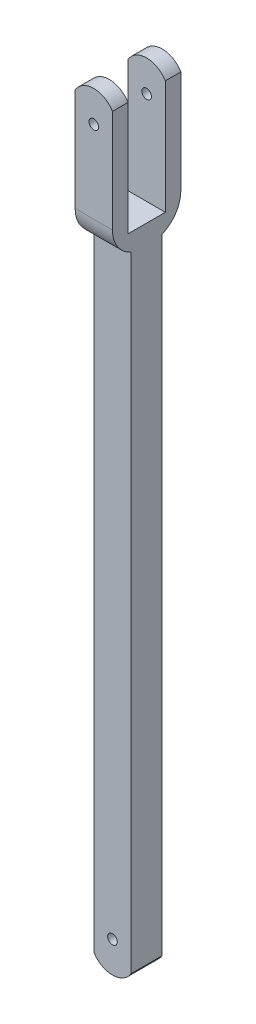
ISO-10303-21;
HEADER;
FILE_DESCRIPTION(('STEP AP214'),'2;1');
FILE_NAME('part.step','',(''),(''),'','','');
FILE_SCHEMA(('AUTOMOTIVE_DESIGN { 1 0 10303 214 1 1 1 1 }'));
ENDSEC;
DATA;
#1=APPLICATION_CONTEXT('core data for automotive mechanical design processes');
#2=APPLICATION_PROTOCOL_DEFINITION('international standard','automotive_design',2000,#1);
#3=PRODUCT_CONTEXT('',#1,'mechanical');
#4=PRODUCT('Part','Part','',(#3));
#5=PRODUCT_RELATED_PRODUCT_CATEGORY('part','',(#4));
#6=PRODUCT_DEFINITION_FORMATION('','',#4);
#7=PRODUCT_DEFINITION_CONTEXT('part definition',#1,'design');
#8=PRODUCT_DEFINITION('design','',#6,#7);
#9=PRODUCT_DEFINITION_SHAPE('','',#8);
#10=(LENGTH_UNIT() NAMED_UNIT(*) SI_UNIT(.MILLI.,.METRE.));
#11=(NAMED_UNIT(*) PLANE_ANGLE_UNIT() SI_UNIT($,.RADIAN.));
#12=(NAMED_UNIT(*) SI_UNIT($,.STERADIAN.) SOLID_ANGLE_UNIT());
#13=UNCERTAINTY_MEASURE_WITH_UNIT(LENGTH_MEASURE(1.E-05),#10,'distance_accuracy_value','');
#14=(GEOMETRIC_REPRESENTATION_CONTEXT(3) GLOBAL_UNCERTAINTY_ASSIGNED_CONTEXT((#13)) GLOBAL_UNIT_ASSIGNED_CONTEXT((#10,
#11,#12)) REPRESENTATION_CONTEXT('',''));
#15=CARTESIAN_POINT('',(0.,0.,0.));
#16=DIRECTION('',(0.,0.,1.));
#17=DIRECTION('',(1.,0.,0.));
#18=AXIS2_PLACEMENT_3D('',#15,#16,#17);
#19=CARTESIAN_POINT('',(-0.828531952075096,-148.107484930158,-11.));
#20=DIRECTION('',(0.,0.,1.));
#21=DIRECTION('',(1.,0.,0.));
#22=AXIS2_PLACEMENT_3D('',#19,#20,#21);
#23=CYLINDRICAL_SURFACE('',#22,7.);
#24=DIRECTION('',(0.,0.,1.));
#25=VECTOR('',#24,1.);
#26=CARTESIAN_POINT('',(-6.8285319520751,-151.713036205622,-11.));
#27=LINE('',#26,#25);
#28=CARTESIAN_POINT('',(-6.8285319520751,-151.713036205622,-5.));
#29=VERTEX_POINT('',#28);
#30=CARTESIAN_POINT('',(-6.8285319520751,-151.713036205622,5.));
#31=VERTEX_POINT('',#30);
#32=EDGE_CURVE('E137',#29,#31,#27,.T.);
#33=ORIENTED_EDGE('',*,*,#32,.F.);
#34=CARTESIAN_POINT('',(-0.828531952075096,-148.107484930158,-5.));
#35=DIRECTION('',(0.,0.,-1.));
#36=DIRECTION('',(-1.,0.,0.));
#37=AXIS2_PLACEMENT_3D('',#34,#35,#36);
#38=CIRCLE('',#37,7.);
#39=CARTESIAN_POINT('',(5.17146804792493,-151.713036205622,-5.));
#40=VERTEX_POINT('',#39);
#41=EDGE_CURVE('E121',#29,#40,#38,.F.);
#42=ORIENTED_EDGE('',*,*,#41,.T.);
#43=DIRECTION('',(0.,0.,1.));
#44=VECTOR('',#43,1.);
#45=CARTESIAN_POINT('',(5.1714680479249,-151.713036205622,-11.));
#46=LINE('',#45,#44);
#47=CARTESIAN_POINT('',(5.17146804792493,-151.713036205622,5.));
#48=VERTEX_POINT('',#47);
#49=EDGE_CURVE('E145',#40,#48,#46,.T.);
#50=ORIENTED_EDGE('',*,*,#49,.T.);
#51=CARTESIAN_POINT('',(-0.828531952075096,-148.107484930158,5.));
#52=DIRECTION('',(0.,0.,1.));
#53=DIRECTION('',(1.,0.,0.));
#54=AXIS2_PLACEMENT_3D('',#51,#52,#53);
#55=CIRCLE('',#54,7.);
#56=EDGE_CURVE('E144',#48,#31,#55,.F.);
#57=ORIENTED_EDGE('',*,*,#56,.T.);
#58=EDGE_LOOP('',(#33,#42,#50,#57));
#59=FACE_BOUND('',#58,.T.);
#60=ADVANCED_FACE('F33',(#59),#23,.T.);
#61=CARTESIAN_POINT('',(-0.828531952075101,-145.107484930158,-15.3840620433566));
#62=DIRECTION('',(0.,0.,1.));
#63=DIRECTION('',(1.,0.,0.));
#64=AXIS2_PLACEMENT_3D('',#61,#62,#63);
#65=CYLINDRICAL_SURFACE('',#64,1.54999999999999);
#66=CARTESIAN_POINT('',(-0.828531952075101,-145.107484930158,5.));
#67=DIRECTION('',(0.,0.,1.));
#68=DIRECTION('',(1.,0.,0.));
#69=AXIS2_PLACEMENT_3D('',#66,#67,#68);
#70=CIRCLE('',#69,1.54999999999999);
#71=CARTESIAN_POINT('',(0.721468047924893,-145.107484930158,5.));
#72=VERTEX_POINT('',#71);
#73=EDGE_CURVE('E170',#72,#72,#70,.F.);
#74=ORIENTED_EDGE('',*,*,#73,.F.);
#75=EDGE_LOOP('',(#74));
#76=FACE_BOUND('',#75,.T.);
#77=CARTESIAN_POINT('',(-0.828531952075101,-145.107484930158,-5.));
#78=DIRECTION('',(0.,0.,-1.));
#79=DIRECTION('',(-1.,0.,0.));
#80=AXIS2_PLACEMENT_3D('',#77,#78,#79);
#81=CIRCLE('',#80,1.54999999999999);
#82=CARTESIAN_POINT('',(-2.37853195207509,-145.107484930158,-5.));
#83=VERTEX_POINT('',#82);
#84=EDGE_CURVE('E133',#83,#83,#81,.F.);
#85=ORIENTED_EDGE('',*,*,#84,.F.);
#86=EDGE_LOOP('',(#85));
#87=FACE_BOUND('',#86,.T.);
#88=ADVANCED_FACE('F262',(#76,#87),#65,.F.);
#89=CARTESIAN_POINT('',(5.1714680479249,-151.713036205622,-11.));
#90=DIRECTION('',(1.,0.,0.));
#91=DIRECTION('',(0.,1.,0.));
#92=AXIS2_PLACEMENT_3D('',#89,#90,#91);
#93=PLANE('',#92);
#94=DIRECTION('',(0.,1.,0.));
#95=VECTOR('',#94,1.);
#96=CARTESIAN_POINT('',(5.1714680479249,49.2783305657349,-5.));
#97=LINE('',#96,#95);
#98=CARTESIAN_POINT('',(5.1714680479249,49.2783305657349,-5.));
#99=VERTEX_POINT('',#98);
#100=EDGE_CURVE('E128',#40,#99,#97,.T.);
#101=ORIENTED_EDGE('',*,*,#100,.T.);
#102=CARTESIAN_POINT('',(5.17146804792487,58.4434819556466,-0.999999999999999));
#103=DIRECTION('',(1.,0.,0.));
#104=DIRECTION('',(0.,1.,0.));
#105=AXIS2_PLACEMENT_3D('',#102,#103,#104);
#106=CIRCLE('',#105,10.);
#107=CARTESIAN_POINT('',(5.17146804792487,58.4434819556466,-11.));
#108=VERTEX_POINT('',#107);
#109=EDGE_CURVE('E41',#99,#108,#106,.T.);
#110=ORIENTED_EDGE('',*,*,#109,.T.);
#111=DIRECTION('',(0.,1.,0.));
#112=VECTOR('',#111,1.);
#113=CARTESIAN_POINT('',(5.1714680479249,-151.713036205622,-11.));
#114=LINE('',#113,#112);
#115=CARTESIAN_POINT('',(5.17146804792487,91.4980672775201,-11.));
#116=VERTEX_POINT('',#115);
#117=EDGE_CURVE('E184',#108,#116,#114,.T.);
#118=ORIENTED_EDGE('',*,*,#117,.T.);
#119=DIRECTION('',(0.,0.,1.));
#120=VECTOR('',#119,1.);
#121=CARTESIAN_POINT('',(5.17146804792487,91.4980672775201,-11.));
#122=LINE('',#121,#120);
#123=CARTESIAN_POINT('',(5.17146804792487,91.4980672775201,-6.));
#124=VERTEX_POINT('',#123);
#125=EDGE_CURVE('E158',#116,#124,#122,.T.);
#126=ORIENTED_EDGE('',*,*,#125,.T.);
#127=DIRECTION('',(0.,1.,0.));
#128=VECTOR('',#127,1.);
#129=CARTESIAN_POINT('',(5.1714680479249,-151.713036205622,-6.));
#130=LINE('',#129,#128);
#131=CARTESIAN_POINT('',(5.17146804792487,54.8925150698418,-6.));
#132=VERTEX_POINT('',#131);
#133=EDGE_CURVE('E225',#132,#124,#130,.T.);
#134=ORIENTED_EDGE('',*,*,#133,.F.);
#135=DIRECTION('',(0.,0.,-1.));
#136=VECTOR('',#135,1.);
#137=CARTESIAN_POINT('',(5.17146804792487,54.8925150698418,-11.));
#138=LINE('',#137,#136);
#139=CARTESIAN_POINT('',(5.17146804792487,54.8925150698418,6.));
#140=VERTEX_POINT('',#139);
#141=EDGE_CURVE('E221',#140,#132,#138,.T.);
#142=ORIENTED_EDGE('',*,*,#141,.F.);
#143=DIRECTION('',(0.,-1.,0.));
#144=VECTOR('',#143,1.);
#145=CARTESIAN_POINT('',(5.1714680479249,-151.713036205622,6.));
#146=LINE('',#145,#144);
#147=CARTESIAN_POINT('',(5.17146804792487,91.4980672775201,6.));
#148=VERTEX_POINT('',#147);
#149=EDGE_CURVE('E229',#148,#140,#146,.T.);
#150=ORIENTED_EDGE('',*,*,#149,.F.);
#151=CARTESIAN_POINT('',(5.17146804792487,91.4980672775201,11.));
#152=VERTEX_POINT('',#151);
#153=EDGE_CURVE('E148',#148,#152,#122,.T.);
#154=ORIENTED_EDGE('',*,*,#153,.T.);
#155=DIRECTION('',(0.,1.,0.));
#156=VECTOR('',#155,1.);
#157=CARTESIAN_POINT('',(5.1714680479249,-151.713036205622,11.));
#158=LINE('',#157,#156);
#159=CARTESIAN_POINT('',(5.17146804792487,58.4434819556466,11.));
#160=VERTEX_POINT('',#159);
#161=EDGE_CURVE('E236',#160,#152,#158,.T.);
#162=ORIENTED_EDGE('',*,*,#161,.F.);
#163=CARTESIAN_POINT('',(5.17146804792487,58.4434819556466,0.999999999999999));
#164=DIRECTION('',(1.,0.,0.));
#165=DIRECTION('',(0.,1.,0.));
#166=AXIS2_PLACEMENT_3D('',#163,#164,#165);
#167=CIRCLE('',#166,10.);
#168=CARTESIAN_POINT('',(5.1714680479249,49.2783305657349,5.));
#169=VERTEX_POINT('',#168);
#170=EDGE_CURVE('E178',#160,#169,#167,.T.);
#171=ORIENTED_EDGE('',*,*,#170,.T.);
#172=DIRECTION('',(0.,1.,0.));
#173=VECTOR('',#172,1.);
#174=CARTESIAN_POINT('',(5.1714680479249,49.2783305657349,5.));
#175=LINE('',#174,#173);
#176=EDGE_CURVE('E132',#48,#169,#175,.T.);
#177=ORIENTED_EDGE('',*,*,#176,.F.);
#178=ORIENTED_EDGE('',*,*,#49,.F.);
#179=EDGE_LOOP('',(#101,#110,#118,#126,#134,#142,#150,#154,#162,#171,#177,#178));
#180=FACE_BOUND('',#179,.T.);
#181=ADVANCED_FACE('F182',(#180),#93,.T.);
#182=CARTESIAN_POINT('',(-6.8285319520751,-151.713036205622,-11.));
#183=DIRECTION('',(-1.,0.,0.));
#184=DIRECTION('',(0.,-1.,0.));
#185=AXIS2_PLACEMENT_3D('',#182,#183,#184);
#186=PLANE('',#185);
#187=DIRECTION('',(0.,-1.,0.));
#188=VECTOR('',#187,1.);
#189=CARTESIAN_POINT('',(-6.8285319520751,-151.713036205622,-11.));
#190=LINE('',#189,#188);
#191=CARTESIAN_POINT('',(-6.82853195207513,91.4980654130911,-11.));
#192=VERTEX_POINT('',#191);
#193=CARTESIAN_POINT('',(-6.82853195207513,58.4434819556466,-11.));
#194=VERTEX_POINT('',#193);
#195=EDGE_CURVE('E194',#192,#194,#190,.T.);
#196=ORIENTED_EDGE('',*,*,#195,.T.);
#197=CARTESIAN_POINT('',(-6.82853195207513,58.4434819556466,-0.999999999999999));
#198=DIRECTION('',(-1.,0.,0.));
#199=DIRECTION('',(0.,-1.,0.));
#200=AXIS2_PLACEMENT_3D('',#197,#198,#199);
#201=CIRCLE('',#200,10.);
#202=CARTESIAN_POINT('',(-6.82853195207513,49.278330565735,-5.));
#203=VERTEX_POINT('',#202);
#204=EDGE_CURVE('E139',#194,#203,#201,.T.);
#205=ORIENTED_EDGE('',*,*,#204,.T.);
#206=DIRECTION('',(0.,-1.,0.));
#207=VECTOR('',#206,1.);
#208=CARTESIAN_POINT('',(-6.82853195207513,49.278330565735,-5.));
#209=LINE('',#208,#207);
#210=EDGE_CURVE('E125',#203,#29,#209,.T.);
#211=ORIENTED_EDGE('',*,*,#210,.T.);
#212=ORIENTED_EDGE('',*,*,#32,.T.);
#213=DIRECTION('',(0.,-1.,0.));
#214=VECTOR('',#213,1.);
#215=CARTESIAN_POINT('',(-6.82853195207513,49.278330565735,5.));
#216=LINE('',#215,#214);
#217=CARTESIAN_POINT('',(-6.82853195207513,49.278330565735,5.));
#218=VERTEX_POINT('',#217);
#219=EDGE_CURVE('E173',#218,#31,#216,.T.);
#220=ORIENTED_EDGE('',*,*,#219,.F.);
#221=CARTESIAN_POINT('',(-6.82853195207513,58.4434819556466,0.999999999999999));
#222=DIRECTION('',(-1.,0.,0.));
#223=DIRECTION('',(0.,-1.,0.));
#224=AXIS2_PLACEMENT_3D('',#221,#222,#223);
#225=CIRCLE('',#224,10.);
#226=CARTESIAN_POINT('',(-6.82853195207513,58.4434819556466,11.));
#227=VERTEX_POINT('',#226);
#228=EDGE_CURVE('E54',#218,#227,#225,.T.);
#229=ORIENTED_EDGE('',*,*,#228,.T.);
#230=DIRECTION('',(0.,-1.,0.));
#231=VECTOR('',#230,1.);
#232=CARTESIAN_POINT('',(-6.8285319520751,-151.713036205622,11.));
#233=LINE('',#232,#231);
#234=CARTESIAN_POINT('',(-6.82853195207513,91.4980654130911,11.));
#235=VERTEX_POINT('',#234);
#236=EDGE_CURVE('E234',#235,#227,#233,.T.);
#237=ORIENTED_EDGE('',*,*,#236,.F.);
#238=DIRECTION('',(0.,0.,1.));
#239=VECTOR('',#238,1.);
#240=CARTESIAN_POINT('',(-6.82853195207513,91.4980654130911,-11.));
#241=LINE('',#240,#239);
#242=CARTESIAN_POINT('',(-6.82853195207513,91.4980654130911,6.));
#243=VERTEX_POINT('',#242);
#244=EDGE_CURVE('E151',#243,#235,#241,.T.);
#245=ORIENTED_EDGE('',*,*,#244,.F.);
#246=DIRECTION('',(0.,1.,0.));
#247=VECTOR('',#246,1.);
#248=CARTESIAN_POINT('',(-6.8285319520751,-151.713036205622,6.));
#249=LINE('',#248,#247);
#250=CARTESIAN_POINT('',(-6.82853195207513,54.8925150698418,6.));
#251=VERTEX_POINT('',#250);
#252=EDGE_CURVE('E161',#251,#243,#249,.T.);
#253=ORIENTED_EDGE('',*,*,#252,.F.);
#254=DIRECTION('',(0.,0.,1.));
#255=VECTOR('',#254,1.);
#256=CARTESIAN_POINT('',(-6.82853195207513,54.8925150698418,-11.));
#257=LINE('',#256,#255);
#258=CARTESIAN_POINT('',(-6.82853195207513,54.8925150698418,-6.));
#259=VERTEX_POINT('',#258);
#260=EDGE_CURVE('E155',#259,#251,#257,.T.);
#261=ORIENTED_EDGE('',*,*,#260,.F.);
#262=DIRECTION('',(0.,-1.,0.));
#263=VECTOR('',#262,1.);
#264=CARTESIAN_POINT('',(-6.8285319520751,-151.713036205622,-6.));
#265=LINE('',#264,#263);
#266=CARTESIAN_POINT('',(-6.82853195207513,91.4980654130911,-6.));
#267=VERTEX_POINT('',#266);
#268=EDGE_CURVE('E157',#267,#259,#265,.T.);
#269=ORIENTED_EDGE('',*,*,#268,.F.);
#270=EDGE_CURVE('E146',#192,#267,#241,.T.);
#271=ORIENTED_EDGE('',*,*,#270,.F.);
#272=EDGE_LOOP('',(#196,#205,#211,#212,#220,#229,#237,#245,#253,#261,#269,#271));
#273=FACE_BOUND('',#272,.T.);
#274=ADVANCED_FACE('F136',(#273),#186,.T.);
#275=CARTESIAN_POINT('',(-0.828531391883958,87.8925150698418,-11.));
#276=DIRECTION('',(0.,0.,1.));
#277=DIRECTION('',(1.,0.,0.));
#278=AXIS2_PLACEMENT_3D('',#275,#276,#277);
#279=PLANE('',#278);
#280=CARTESIAN_POINT('',(-0.828531952075129,84.8904146624725,-11.));
#281=DIRECTION('',(0.,0.,1.));
#282=DIRECTION('',(1.,0.,0.));
#283=AXIS2_PLACEMENT_3D('',#280,#281,#282);
#284=CIRCLE('',#283,1.54999999999999);
#285=CARTESIAN_POINT('',(0.721468047924863,84.8904146624725,-11.));
#286=VERTEX_POINT('',#285);
#287=EDGE_CURVE('E169',#286,#286,#284,.F.);
#288=ORIENTED_EDGE('',*,*,#287,.F.);
#289=EDGE_LOOP('',(#288));
#290=FACE_BOUND('',#289,.T.);
#291=ORIENTED_EDGE('',*,*,#117,.F.);
#292=DIRECTION('',(1.,0.,0.));
#293=VECTOR('',#292,1.);
#294=CARTESIAN_POINT('',(-0.828531391883992,58.4434819556466,-11.));
#295=LINE('',#294,#293);
#296=EDGE_CURVE('E164',#108,#194,#295,.F.);
#297=ORIENTED_EDGE('',*,*,#296,.T.);
#298=ORIENTED_EDGE('',*,*,#195,.F.);
#299=CARTESIAN_POINT('',(-0.828531391883958,87.8925150698418,-11.));
#300=DIRECTION('',(0.,0.,1.));
#301=DIRECTION('',(1.,0.,0.));
#302=AXIS2_PLACEMENT_3D('',#299,#300,#301);
#303=CIRCLE('',#302,7.);
#304=EDGE_CURVE('E193',#116,#192,#303,.T.);
#305=ORIENTED_EDGE('',*,*,#304,.F.);
#306=EDGE_LOOP('',(#291,#297,#298,#305));
#307=FACE_BOUND('',#306,.T.);
#308=ADVANCED_FACE('F190',(#290,#307),#279,.F.);
#309=CARTESIAN_POINT('',(-0.828531391883958,87.8925150698418,-11.));
#310=DIRECTION('',(0.,0.,1.));
#311=DIRECTION('',(1.,0.,0.));
#312=AXIS2_PLACEMENT_3D('',#309,#310,#311);
#313=CYLINDRICAL_SURFACE('',#312,7.);
#314=ORIENTED_EDGE('',*,*,#270,.T.);
#315=CARTESIAN_POINT('',(-0.828531391883958,87.8925150698418,-6.));
#316=DIRECTION('',(0.,0.,-1.));
#317=DIRECTION('',(-1.,0.,0.));
#318=AXIS2_PLACEMENT_3D('',#315,#316,#317);
#319=CIRCLE('',#318,7.);
#320=EDGE_CURVE('E223',#124,#267,#319,.F.);
#321=ORIENTED_EDGE('',*,*,#320,.F.);
#322=ORIENTED_EDGE('',*,*,#125,.F.);
#323=ORIENTED_EDGE('',*,*,#304,.T.);
#324=EDGE_LOOP('',(#314,#321,#322,#323));
#325=FACE_BOUND('',#324,.T.);
#326=ADVANCED_FACE('F282',(#325),#313,.T.);
#327=CARTESIAN_POINT('',(-0.828531391883958,87.8925150698418,6.));
#328=DIRECTION('',(0.,0.,1.));
#329=DIRECTION('',(1.,0.,0.));
#330=AXIS2_PLACEMENT_3D('',#327,#328,#329);
#331=CIRCLE('',#330,7.);
#332=EDGE_CURVE('E227',#243,#148,#331,.F.);
#333=ORIENTED_EDGE('',*,*,#332,.F.);
#334=ORIENTED_EDGE('',*,*,#244,.T.);
#335=CARTESIAN_POINT('',(-0.828531391883958,87.8925150698418,11.));
#336=DIRECTION('',(0.,0.,1.));
#337=DIRECTION('',(1.,0.,0.));
#338=AXIS2_PLACEMENT_3D('',#335,#336,#337);
#339=CIRCLE('',#338,7.);
#340=EDGE_CURVE('E231',#152,#235,#339,.T.);
#341=ORIENTED_EDGE('',*,*,#340,.F.);
#342=ORIENTED_EDGE('',*,*,#153,.F.);
#343=EDGE_LOOP('',(#333,#334,#341,#342));
#344=FACE_BOUND('',#343,.T.);
#345=ADVANCED_FACE('F247',(#344),#313,.T.);
#346=CARTESIAN_POINT('',(-0.828531391883958,87.8925150698418,11.));
#347=DIRECTION('',(0.,0.,1.));
#348=DIRECTION('',(1.,0.,0.));
#349=AXIS2_PLACEMENT_3D('',#346,#347,#348);
#350=PLANE('',#349);
#351=ORIENTED_EDGE('',*,*,#236,.T.);
#352=DIRECTION('',(-1.,0.,0.));
#353=VECTOR('',#352,1.);
#354=CARTESIAN_POINT('',(5.17146804792488,58.4434819556466,11.));
#355=LINE('',#354,#353);
#356=EDGE_CURVE('E11',#227,#160,#355,.F.);
#357=ORIENTED_EDGE('',*,*,#356,.T.);
#358=ORIENTED_EDGE('',*,*,#161,.T.);
#359=ORIENTED_EDGE('',*,*,#340,.T.);
#360=EDGE_LOOP('',(#351,#357,#358,#359));
#361=FACE_BOUND('',#360,.T.);
#362=CARTESIAN_POINT('',(-0.828531952075129,84.8904146624725,11.));
#363=DIRECTION('',(0.,0.,1.));
#364=DIRECTION('',(1.,0.,0.));
#365=AXIS2_PLACEMENT_3D('',#362,#363,#364);
#366=CIRCLE('',#365,1.54999999999999);
#367=CARTESIAN_POINT('',(0.721468047924863,84.8904146624725,11.));
#368=VERTEX_POINT('',#367);
#369=EDGE_CURVE('E209',#368,#368,#366,.T.);
#370=ORIENTED_EDGE('',*,*,#369,.F.);
#371=EDGE_LOOP('',(#370));
#372=FACE_BOUND('',#371,.T.);
#373=ADVANCED_FACE('F249',(#361,#372),#350,.T.);
#374=CARTESIAN_POINT('',(-8.08867219103316,54.8925150698418,6.));
#375=DIRECTION('',(0.,0.,1.));
#376=DIRECTION('',(1.,0.,0.));
#377=AXIS2_PLACEMENT_3D('',#374,#375,#376);
#378=PLANE('',#377);
#379=CARTESIAN_POINT('',(-0.828531952075129,84.8904146624725,6.));
#380=DIRECTION('',(0.,0.,1.));
#381=DIRECTION('',(1.,0.,0.));
#382=AXIS2_PLACEMENT_3D('',#379,#380,#381);
#383=CIRCLE('',#382,1.54999999999999);
#384=CARTESIAN_POINT('',(0.721468047924863,84.8904146624725,6.));
#385=VERTEX_POINT('',#384);
#386=EDGE_CURVE('E168',#385,#385,#383,.T.);
#387=ORIENTED_EDGE('',*,*,#386,.T.);
#388=EDGE_LOOP('',(#387));
#389=FACE_BOUND('',#388,.T.);
#390=ORIENTED_EDGE('',*,*,#149,.T.);
#391=DIRECTION('',(1.,0.,0.));
#392=VECTOR('',#391,1.);
#393=CARTESIAN_POINT('',(-8.08867219103316,54.8925150698418,6.));
#394=LINE('',#393,#392);
#395=EDGE_CURVE('E218',#251,#140,#394,.T.);
#396=ORIENTED_EDGE('',*,*,#395,.F.);
#397=ORIENTED_EDGE('',*,*,#252,.T.);
#398=ORIENTED_EDGE('',*,*,#332,.T.);
#399=EDGE_LOOP('',(#390,#396,#397,#398));
#400=FACE_BOUND('',#399,.T.);
#401=ADVANCED_FACE('F287',(#389,#400),#378,.F.);
#402=CARTESIAN_POINT('',(-8.08867219103316,54.8925150698418,-6.));
#403=DIRECTION('',(0.,0.,-1.));
#404=DIRECTION('',(-1.,0.,0.));
#405=AXIS2_PLACEMENT_3D('',#402,#403,#404);
#406=PLANE('',#405);
#407=CARTESIAN_POINT('',(-0.828531952075129,84.8904146624725,-6.));
#408=DIRECTION('',(0.,0.,-1.));
#409=DIRECTION('',(-1.,0.,0.));
#410=AXIS2_PLACEMENT_3D('',#407,#408,#409);
#411=CIRCLE('',#410,1.54999999999999);
#412=CARTESIAN_POINT('',(-2.37853195207512,84.8904146624725,-6.));
#413=VERTEX_POINT('',#412);
#414=EDGE_CURVE('E165',#413,#413,#411,.T.);
#415=ORIENTED_EDGE('',*,*,#414,.T.);
#416=EDGE_LOOP('',(#415));
#417=FACE_BOUND('',#416,.T.);
#418=ORIENTED_EDGE('',*,*,#133,.T.);
#419=ORIENTED_EDGE('',*,*,#320,.T.);
#420=ORIENTED_EDGE('',*,*,#268,.T.);
#421=DIRECTION('',(-1.,0.,0.));
#422=VECTOR('',#421,1.);
#423=CARTESIAN_POINT('',(-8.08867219103316,54.8925150698418,-6.));
#424=LINE('',#423,#422);
#425=EDGE_CURVE('E216',#132,#259,#424,.T.);
#426=ORIENTED_EDGE('',*,*,#425,.F.);
#427=EDGE_LOOP('',(#418,#419,#420,#426));
#428=FACE_BOUND('',#427,.T.);
#429=ADVANCED_FACE('F300',(#417,#428),#406,.F.);
#430=CARTESIAN_POINT('',(0.,54.8925150698418,0.));
#431=DIRECTION('',(0.,-1.,0.));
#432=DIRECTION('',(0.,0.,-1.));
#433=AXIS2_PLACEMENT_3D('',#430,#431,#432);
#434=PLANE('',#433);
#435=ORIENTED_EDGE('',*,*,#141,.T.);
#436=ORIENTED_EDGE('',*,*,#425,.T.);
#437=ORIENTED_EDGE('',*,*,#260,.T.);
#438=ORIENTED_EDGE('',*,*,#395,.T.);
#439=EDGE_LOOP('',(#435,#436,#437,#438));
#440=FACE_BOUND('',#439,.T.);
#441=ADVANCED_FACE('F302',(#440),#434,.F.);
#442=CARTESIAN_POINT('',(-0.828531952075129,84.8904146624725,-15.3840620433566));
#443=DIRECTION('',(0.,0.,1.));
#444=DIRECTION('',(1.,0.,0.));
#445=AXIS2_PLACEMENT_3D('',#442,#443,#444);
#446=CYLINDRICAL_SURFACE('',#445,1.54999999999999);
#447=ORIENTED_EDGE('',*,*,#287,.T.);
#448=EDGE_LOOP('',(#447));
#449=FACE_BOUND('',#448,.T.);
#450=ORIENTED_EDGE('',*,*,#414,.F.);
#451=EDGE_LOOP('',(#450));
#452=FACE_BOUND('',#451,.T.);
#453=ADVANCED_FACE('F315',(#449,#452),#446,.F.);
#454=ORIENTED_EDGE('',*,*,#369,.T.);
#455=EDGE_LOOP('',(#454));
#456=FACE_BOUND('',#455,.T.);
#457=ORIENTED_EDGE('',*,*,#386,.F.);
#458=EDGE_LOOP('',(#457));
#459=FACE_BOUND('',#458,.T.);
#460=ADVANCED_FACE('F258',(#456,#459),#446,.F.);
#461=CARTESIAN_POINT('',(-0.828531952075084,-151.713036205622,5.));
#462=DIRECTION('',(0.,0.,1.));
#463=DIRECTION('',(1.,0.,0.));
#464=AXIS2_PLACEMENT_3D('',#461,#462,#463);
#465=PLANE('',#464);
#466=ORIENTED_EDGE('',*,*,#176,.T.);
#467=DIRECTION('',(-1.,0.,0.));
#468=VECTOR('',#467,1.);
#469=CARTESIAN_POINT('',(-6.82853195207513,49.278330565735,5.));
#470=LINE('',#469,#468);
#471=EDGE_CURVE('E204',#169,#218,#470,.T.);
#472=ORIENTED_EDGE('',*,*,#471,.T.);
#473=ORIENTED_EDGE('',*,*,#219,.T.);
#474=ORIENTED_EDGE('',*,*,#56,.F.);
#475=EDGE_LOOP('',(#466,#472,#473,#474));
#476=FACE_BOUND('',#475,.T.);
#477=ORIENTED_EDGE('',*,*,#73,.T.);
#478=EDGE_LOOP('',(#477));
#479=FACE_BOUND('',#478,.T.);
#480=ADVANCED_FACE('F255',(#476,#479),#465,.T.);
#481=CARTESIAN_POINT('',(-0.828531952075084,-151.713036205622,-5.));
#482=DIRECTION('',(0.,0.,-1.));
#483=DIRECTION('',(1.,0.,0.));
#484=AXIS2_PLACEMENT_3D('',#481,#482,#483);
#485=PLANE('',#484);
#486=ORIENTED_EDGE('',*,*,#210,.F.);
#487=DIRECTION('',(-1.,0.,0.));
#488=VECTOR('',#487,1.);
#489=CARTESIAN_POINT('',(-6.82853195207513,49.278330565735,-5.));
#490=LINE('',#489,#488);
#491=EDGE_CURVE('E140',#99,#203,#490,.T.);
#492=ORIENTED_EDGE('',*,*,#491,.F.);
#493=ORIENTED_EDGE('',*,*,#100,.F.);
#494=ORIENTED_EDGE('',*,*,#41,.F.);
#495=EDGE_LOOP('',(#486,#492,#493,#494));
#496=FACE_BOUND('',#495,.T.);
#497=ORIENTED_EDGE('',*,*,#84,.T.);
#498=EDGE_LOOP('',(#497));
#499=FACE_BOUND('',#498,.T.);
#500=ADVANCED_FACE('F123',(#496,#499),#485,.T.);
#501=CARTESIAN_POINT('',(-6.82853195207512,58.4434819556466,-0.999999999999999));
#502=DIRECTION('',(1.,0.,0.));
#503=DIRECTION('',(0.,1.,0.));
#504=AXIS2_PLACEMENT_3D('',#501,#502,#503);
#505=CYLINDRICAL_SURFACE('',#504,10.);
#506=ORIENTED_EDGE('',*,*,#109,.F.);
#507=ORIENTED_EDGE('',*,*,#491,.T.);
#508=ORIENTED_EDGE('',*,*,#204,.F.);
#509=ORIENTED_EDGE('',*,*,#296,.F.);
#510=EDGE_LOOP('',(#506,#507,#508,#509));
#511=FACE_BOUND('',#510,.T.);
#512=ADVANCED_FACE('F196',(#511),#505,.T.);
#513=CARTESIAN_POINT('',(-6.82853195207512,58.4434819556466,0.999999999999999));
#514=DIRECTION('',(1.,0.,0.));
#515=DIRECTION('',(0.,1.,0.));
#516=AXIS2_PLACEMENT_3D('',#513,#514,#515);
#517=CYLINDRICAL_SURFACE('',#516,10.);
#518=ORIENTED_EDGE('',*,*,#170,.F.);
#519=ORIENTED_EDGE('',*,*,#356,.F.);
#520=ORIENTED_EDGE('',*,*,#228,.F.);
#521=ORIENTED_EDGE('',*,*,#471,.F.);
#522=EDGE_LOOP('',(#518,#519,#520,#521));
#523=FACE_BOUND('',#522,.T.);
#524=ADVANCED_FACE('F35',(#523),#517,.T.);
#525=CLOSED_SHELL('',(#60,#88,#181,#274,#308,#326,#345,#373,#401,#429,#441,#453,#460,#480,#500,
#512,#524));
#526=MANIFOLD_SOLID_BREP('B2',#525);
#527=ADVANCED_BREP_SHAPE_REPRESENTATION('',(#18,#526),#14);
#528=SHAPE_DEFINITION_REPRESENTATION(#9,#527);
ENDSEC;
END-ISO-10303-21;
